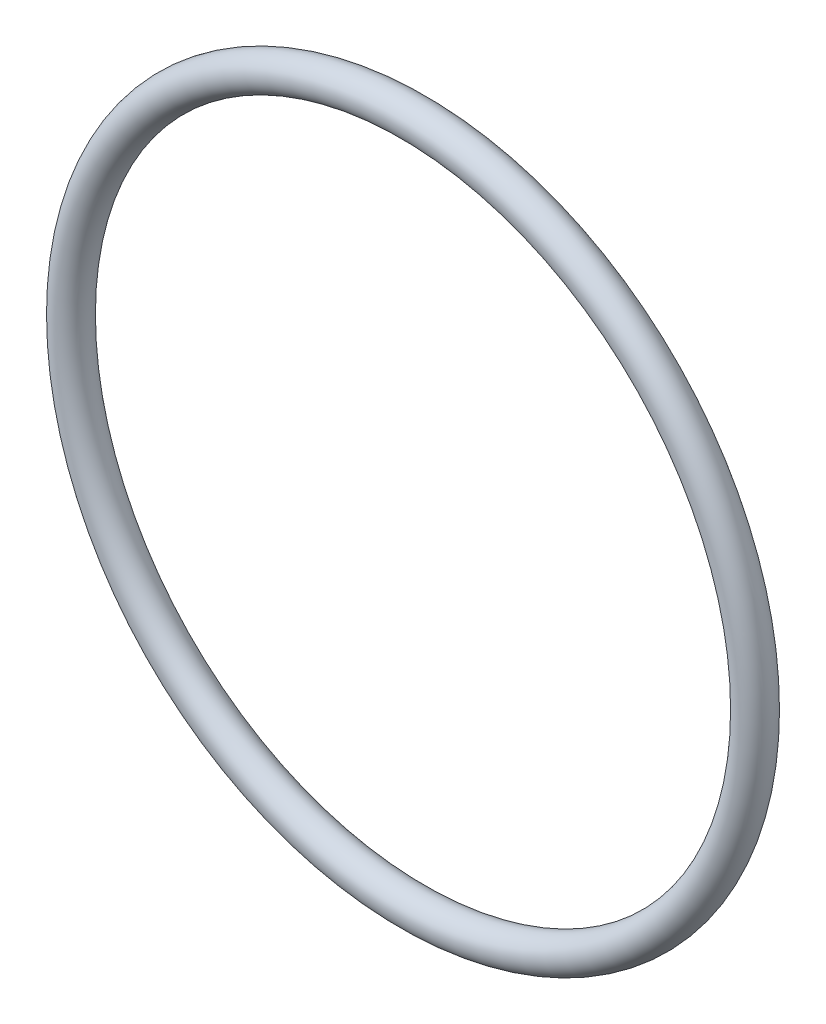
ISO-10303-21;
HEADER;
FILE_DESCRIPTION(('STEP AP214'),'2;1');
FILE_NAME('part.step','',(''),(''),'','','');
FILE_SCHEMA(('AUTOMOTIVE_DESIGN { 1 0 10303 214 1 1 1 1 }'));
ENDSEC;
DATA;
#1=APPLICATION_CONTEXT('core data for automotive mechanical design processes');
#2=APPLICATION_PROTOCOL_DEFINITION('international standard','automotive_design',2000,#1);
#3=PRODUCT_CONTEXT('',#1,'mechanical');
#4=PRODUCT('Part','Part','',(#3));
#5=PRODUCT_RELATED_PRODUCT_CATEGORY('part','',(#4));
#6=PRODUCT_DEFINITION_FORMATION('','',#4);
#7=PRODUCT_DEFINITION_CONTEXT('part definition',#1,'design');
#8=PRODUCT_DEFINITION('design','',#6,#7);
#9=PRODUCT_DEFINITION_SHAPE('','',#8);
#10=(LENGTH_UNIT() NAMED_UNIT(*) SI_UNIT(.MILLI.,.METRE.));
#11=(NAMED_UNIT(*) PLANE_ANGLE_UNIT() SI_UNIT($,.RADIAN.));
#12=(NAMED_UNIT(*) SI_UNIT($,.STERADIAN.) SOLID_ANGLE_UNIT());
#13=UNCERTAINTY_MEASURE_WITH_UNIT(LENGTH_MEASURE(1.E-05),#10,'distance_accuracy_value','');
#14=(GEOMETRIC_REPRESENTATION_CONTEXT(3) GLOBAL_UNCERTAINTY_ASSIGNED_CONTEXT((#13)) GLOBAL_UNIT_ASSIGNED_CONTEXT((#10,
#11,#12)) REPRESENTATION_CONTEXT('',''));
#15=CARTESIAN_POINT('',(0.,0.,0.));
#16=DIRECTION('',(0.,0.,1.));
#17=DIRECTION('',(1.,0.,0.));
#18=AXIS2_PLACEMENT_3D('',#15,#16,#17);
#19=CARTESIAN_POINT('',(0.,0.,0.));
#20=DIRECTION('',(0.,0.,-1.));
#21=DIRECTION('',(-1.,0.,0.));
#22=AXIS2_PLACEMENT_3D('',#19,#20,#21);
#23=TOROIDAL_SURFACE('',#22,16.3195,0.825500000000003);
#24=CARTESIAN_POINT('',(-17.145,0.,0.));
#25=VERTEX_POINT('',#24);
#26=VERTEX_LOOP('',#25);
#27=FACE_BOUND('',#26,.T.);
#28=ADVANCED_FACE('F28',(#27),#23,.T.);
#29=CLOSED_SHELL('',(#28));
#30=MANIFOLD_SOLID_BREP('B2',#29);
#31=ADVANCED_BREP_SHAPE_REPRESENTATION('',(#18,#30),#14);
#32=SHAPE_DEFINITION_REPRESENTATION(#9,#31);
ENDSEC;
END-ISO-10303-21;
